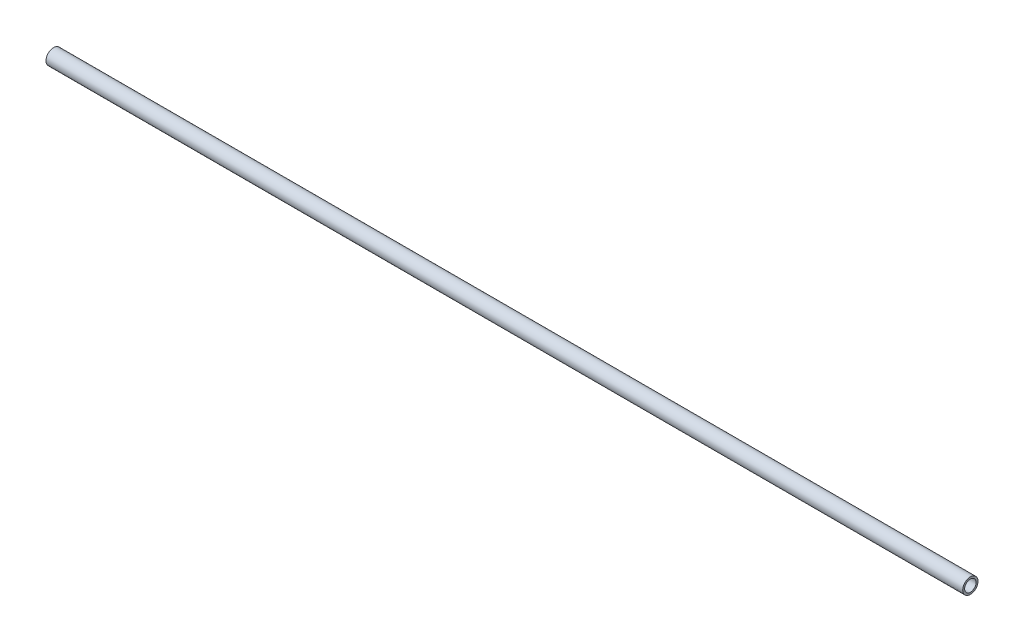
ISO-10303-21;
HEADER;
FILE_DESCRIPTION(('STEP AP214'),'2;1');
FILE_NAME('part.step','',(''),(''),'','','');
FILE_SCHEMA(('AUTOMOTIVE_DESIGN { 1 0 10303 214 1 1 1 1 }'));
ENDSEC;
DATA;
#1=APPLICATION_CONTEXT('core data for automotive mechanical design processes');
#2=APPLICATION_PROTOCOL_DEFINITION('international standard','automotive_design',2000,#1);
#3=PRODUCT_CONTEXT('',#1,'mechanical');
#4=PRODUCT('Part','Part','',(#3));
#5=PRODUCT_RELATED_PRODUCT_CATEGORY('part','',(#4));
#6=PRODUCT_DEFINITION_FORMATION('','',#4);
#7=PRODUCT_DEFINITION_CONTEXT('part definition',#1,'design');
#8=PRODUCT_DEFINITION('design','',#6,#7);
#9=PRODUCT_DEFINITION_SHAPE('','',#8);
#10=(LENGTH_UNIT() NAMED_UNIT(*) SI_UNIT(.MILLI.,.METRE.));
#11=(NAMED_UNIT(*) PLANE_ANGLE_UNIT() SI_UNIT($,.RADIAN.));
#12=(NAMED_UNIT(*) SI_UNIT($,.STERADIAN.) SOLID_ANGLE_UNIT());
#13=UNCERTAINTY_MEASURE_WITH_UNIT(LENGTH_MEASURE(1.E-05),#10,'distance_accuracy_value','');
#14=(GEOMETRIC_REPRESENTATION_CONTEXT(3) GLOBAL_UNCERTAINTY_ASSIGNED_CONTEXT((#13)) GLOBAL_UNIT_ASSIGNED_CONTEXT((#10,
#11,#12)) REPRESENTATION_CONTEXT('',''));
#15=CARTESIAN_POINT('',(0.,0.,0.));
#16=DIRECTION('',(0.,0.,1.));
#17=DIRECTION('',(1.,0.,0.));
#18=AXIS2_PLACEMENT_3D('',#15,#16,#17);
#19=CARTESIAN_POINT('',(1524.,0.,0.));
#20=DIRECTION('',(1.,0.,0.));
#21=DIRECTION('',(0.,0.,-1.));
#22=AXIS2_PLACEMENT_3D('',#19,#20,#21);
#23=PLANE('',#22);
#24=CARTESIAN_POINT('',(1524.,0.,0.));
#25=DIRECTION('',(1.,0.,0.));
#26=DIRECTION('',(0.,0.,-1.));
#27=AXIS2_PLACEMENT_3D('',#24,#25,#26);
#28=CIRCLE('',#27,12.7);
#29=CARTESIAN_POINT('',(1524.,0.,-12.7));
#30=VERTEX_POINT('',#29);
#31=EDGE_CURVE('E10',#30,#30,#28,.T.);
#32=ORIENTED_EDGE('',*,*,#31,.T.);
#33=EDGE_LOOP('',(#32));
#34=FACE_BOUND('',#33,.T.);
#35=CARTESIAN_POINT('',(1524.,0.,0.));
#36=DIRECTION('',(1.,0.,0.));
#37=DIRECTION('',(0.,0.,-1.));
#38=AXIS2_PLACEMENT_3D('',#35,#36,#37);
#39=CIRCLE('',#38,9.525);
#40=CARTESIAN_POINT('',(1524.,0.,-9.525));
#41=VERTEX_POINT('',#40);
#42=EDGE_CURVE('E50',#41,#41,#39,.T.);
#43=ORIENTED_EDGE('',*,*,#42,.F.);
#44=EDGE_LOOP('',(#43));
#45=FACE_BOUND('',#44,.T.);
#46=ADVANCED_FACE('F37',(#34,#45),#23,.T.);
#47=CARTESIAN_POINT('',(0.,0.,0.));
#48=DIRECTION('',(1.,0.,0.));
#49=DIRECTION('',(0.,0.,-1.));
#50=AXIS2_PLACEMENT_3D('',#47,#48,#49);
#51=PLANE('',#50);
#52=CARTESIAN_POINT('',(0.,0.,0.));
#53=DIRECTION('',(1.,0.,0.));
#54=DIRECTION('',(0.,0.,-1.));
#55=AXIS2_PLACEMENT_3D('',#52,#53,#54);
#56=CIRCLE('',#55,12.7);
#57=CARTESIAN_POINT('',(0.,0.,-12.7));
#58=VERTEX_POINT('',#57);
#59=EDGE_CURVE('E41',#58,#58,#56,.T.);
#60=ORIENTED_EDGE('',*,*,#59,.F.);
#61=EDGE_LOOP('',(#60));
#62=FACE_BOUND('',#61,.T.);
#63=CARTESIAN_POINT('',(0.,0.,0.));
#64=DIRECTION('',(1.,0.,0.));
#65=DIRECTION('',(0.,0.,-1.));
#66=AXIS2_PLACEMENT_3D('',#63,#64,#65);
#67=CIRCLE('',#66,9.525);
#68=CARTESIAN_POINT('',(0.,0.,-9.525));
#69=VERTEX_POINT('',#68);
#70=EDGE_CURVE('E52',#69,#69,#67,.T.);
#71=ORIENTED_EDGE('',*,*,#70,.T.);
#72=EDGE_LOOP('',(#71));
#73=FACE_BOUND('',#72,.T.);
#74=ADVANCED_FACE('F64',(#62,#73),#51,.F.);
#75=CARTESIAN_POINT('',(1524.,0.,0.));
#76=DIRECTION('',(-1.,0.,0.));
#77=DIRECTION('',(0.,0.,1.));
#78=AXIS2_PLACEMENT_3D('',#75,#76,#77);
#79=CYLINDRICAL_SURFACE('',#78,12.7);
#80=ORIENTED_EDGE('',*,*,#31,.F.);
#81=EDGE_LOOP('',(#80));
#82=FACE_BOUND('',#81,.T.);
#83=ORIENTED_EDGE('',*,*,#59,.T.);
#84=EDGE_LOOP('',(#83));
#85=FACE_BOUND('',#84,.T.);
#86=ADVANCED_FACE('F39',(#82,#85),#79,.T.);
#87=CARTESIAN_POINT('',(1524.,0.,0.));
#88=DIRECTION('',(-1.,0.,0.));
#89=DIRECTION('',(0.,0.,1.));
#90=AXIS2_PLACEMENT_3D('',#87,#88,#89);
#91=CYLINDRICAL_SURFACE('',#90,9.525);
#92=ORIENTED_EDGE('',*,*,#42,.T.);
#93=EDGE_LOOP('',(#92));
#94=FACE_BOUND('',#93,.T.);
#95=ORIENTED_EDGE('',*,*,#70,.F.);
#96=EDGE_LOOP('',(#95));
#97=FACE_BOUND('',#96,.T.);
#98=ADVANCED_FACE('F60',(#94,#97),#91,.F.);
#99=CLOSED_SHELL('',(#46,#74,#86,#98));
#100=MANIFOLD_SOLID_BREP('B2',#99);
#101=ADVANCED_BREP_SHAPE_REPRESENTATION('',(#18,#100),#14);
#102=SHAPE_DEFINITION_REPRESENTATION(#9,#101);
ENDSEC;
END-ISO-10303-21;
